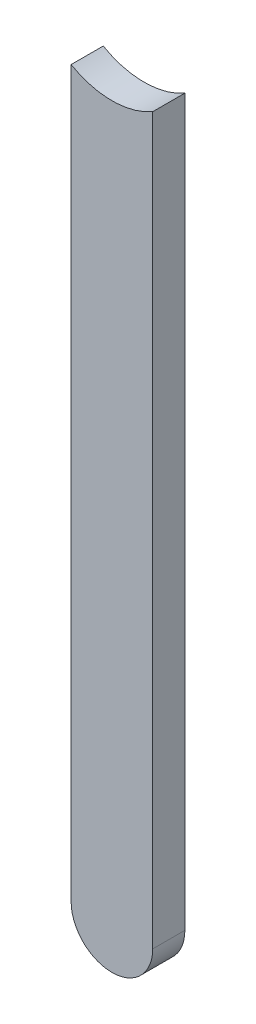
ISO-10303-21;
HEADER;
FILE_DESCRIPTION(('STEP AP214'),'2;1');
FILE_NAME('part.step','',(''),(''),'','','');
FILE_SCHEMA(('AUTOMOTIVE_DESIGN { 1 0 10303 214 1 1 1 1 }'));
ENDSEC;
DATA;
#1=APPLICATION_CONTEXT('core data for automotive mechanical design processes');
#2=APPLICATION_PROTOCOL_DEFINITION('international standard','automotive_design',2000,#1);
#3=PRODUCT_CONTEXT('',#1,'mechanical');
#4=PRODUCT('Part','Part','',(#3));
#5=PRODUCT_RELATED_PRODUCT_CATEGORY('part','',(#4));
#6=PRODUCT_DEFINITION_FORMATION('','',#4);
#7=PRODUCT_DEFINITION_CONTEXT('part definition',#1,'design');
#8=PRODUCT_DEFINITION('design','',#6,#7);
#9=PRODUCT_DEFINITION_SHAPE('','',#8);
#10=(LENGTH_UNIT() NAMED_UNIT(*) SI_UNIT(.MILLI.,.METRE.));
#11=(NAMED_UNIT(*) PLANE_ANGLE_UNIT() SI_UNIT($,.RADIAN.));
#12=(NAMED_UNIT(*) SI_UNIT($,.STERADIAN.) SOLID_ANGLE_UNIT());
#13=UNCERTAINTY_MEASURE_WITH_UNIT(LENGTH_MEASURE(1.E-05),#10,'distance_accuracy_value','');
#14=(GEOMETRIC_REPRESENTATION_CONTEXT(3) GLOBAL_UNCERTAINTY_ASSIGNED_CONTEXT((#13)) GLOBAL_UNIT_ASSIGNED_CONTEXT((#10,
#11,#12)) REPRESENTATION_CONTEXT('',''));
#15=CARTESIAN_POINT('',(0.,0.,0.));
#16=DIRECTION('',(0.,0.,1.));
#17=DIRECTION('',(1.,0.,0.));
#18=AXIS2_PLACEMENT_3D('',#15,#16,#17);
#19=CARTESIAN_POINT('',(144.272,113.03,0.));
#20=DIRECTION('',(-1.,0.,0.));
#21=DIRECTION('',(0.,1.,0.));
#22=AXIS2_PLACEMENT_3D('',#19,#20,#21);
#23=PLANE('',#22);
#24=DIRECTION('',(0.,1.,0.));
#25=VECTOR('',#24,1.);
#26=CARTESIAN_POINT('',(144.272,113.03,0.1999996));
#27=LINE('',#26,#25);
#28=CARTESIAN_POINT('',(144.272,113.03,0.1999996));
#29=VERTEX_POINT('',#28);
#30=CARTESIAN_POINT('',(144.272,117.543059094878,0.1999996));
#31=VERTEX_POINT('',#30);
#32=EDGE_CURVE('E11',#29,#31,#27,.T.);
#33=ORIENTED_EDGE('',*,*,#32,.F.);
#34=DIRECTION('',(0.,0.,1.));
#35=VECTOR('',#34,1.);
#36=CARTESIAN_POINT('',(144.272,113.03,0.));
#37=LINE('',#36,#35);
#38=CARTESIAN_POINT('',(144.272,113.03,0.));
#39=VERTEX_POINT('',#38);
#40=EDGE_CURVE('E24',#39,#29,#37,.T.);
#41=ORIENTED_EDGE('',*,*,#40,.F.);
#42=DIRECTION('',(0.,1.,0.));
#43=VECTOR('',#42,1.);
#44=CARTESIAN_POINT('',(144.272,113.03,0.));
#45=LINE('',#44,#43);
#46=CARTESIAN_POINT('',(144.272,117.543059094878,0.));
#47=VERTEX_POINT('',#46);
#48=EDGE_CURVE('E75',#39,#47,#45,.T.);
#49=ORIENTED_EDGE('',*,*,#48,.T.);
#50=DIRECTION('',(0.,0.,1.));
#51=VECTOR('',#50,1.);
#52=CARTESIAN_POINT('',(144.272,117.543059094878,0.));
#53=LINE('',#52,#51);
#54=EDGE_CURVE('E37',#47,#31,#53,.T.);
#55=ORIENTED_EDGE('',*,*,#54,.T.);
#56=EDGE_LOOP('',(#33,#41,#49,#55));
#57=FACE_BOUND('',#56,.T.);
#58=ADVANCED_FACE('F17',(#57),#23,.F.);
#59=CARTESIAN_POINT('',(144.018,117.983,0.));
#60=DIRECTION('',(0.,0.,-1.));
#61=DIRECTION('',(1.,0.,0.));
#62=AXIS2_PLACEMENT_3D('',#59,#60,#61);
#63=CYLINDRICAL_SURFACE('',#62,0.508);
#64=DIRECTION('',(0.,0.,1.));
#65=VECTOR('',#64,1.);
#66=CARTESIAN_POINT('',(143.764,117.543059094878,0.));
#67=LINE('',#66,#65);
#68=CARTESIAN_POINT('',(143.764,117.543059094878,0.));
#69=VERTEX_POINT('',#68);
#70=CARTESIAN_POINT('',(143.764,117.543059094878,0.1999996));
#71=VERTEX_POINT('',#70);
#72=EDGE_CURVE('E67',#69,#71,#67,.T.);
#73=ORIENTED_EDGE('',*,*,#72,.T.);
#74=CARTESIAN_POINT('',(144.018,117.983,0.1999996));
#75=DIRECTION('',(0.,0.,1.));
#76=DIRECTION('',(1.,0.,0.));
#77=AXIS2_PLACEMENT_3D('',#74,#75,#76);
#78=CIRCLE('',#77,0.508);
#79=EDGE_CURVE('E82',#71,#31,#78,.T.);
#80=ORIENTED_EDGE('',*,*,#79,.T.);
#81=ORIENTED_EDGE('',*,*,#54,.F.);
#82=CARTESIAN_POINT('',(144.018,117.983,0.));
#83=DIRECTION('',(0.,0.,1.));
#84=DIRECTION('',(1.,0.,0.));
#85=AXIS2_PLACEMENT_3D('',#82,#83,#84);
#86=CIRCLE('',#85,0.508);
#87=EDGE_CURVE('E80',#69,#47,#86,.T.);
#88=ORIENTED_EDGE('',*,*,#87,.F.);
#89=EDGE_LOOP('',(#73,#80,#81,#88));
#90=FACE_BOUND('',#89,.T.);
#91=ADVANCED_FACE('F88',(#90),#63,.F.);
#92=CARTESIAN_POINT('',(143.764,117.543059094878,0.));
#93=DIRECTION('',(1.,0.,0.));
#94=DIRECTION('',(0.,-1.,0.));
#95=AXIS2_PLACEMENT_3D('',#92,#93,#94);
#96=PLANE('',#95);
#97=DIRECTION('',(0.,-1.,0.));
#98=VECTOR('',#97,1.);
#99=CARTESIAN_POINT('',(143.764,117.983,0.1999996));
#100=LINE('',#99,#98);
#101=CARTESIAN_POINT('',(143.764,113.03,0.1999996));
#102=VERTEX_POINT('',#101);
#103=EDGE_CURVE('E71',#71,#102,#100,.T.);
#104=ORIENTED_EDGE('',*,*,#103,.F.);
#105=ORIENTED_EDGE('',*,*,#72,.F.);
#106=DIRECTION('',(0.,-1.,0.));
#107=VECTOR('',#106,1.);
#108=CARTESIAN_POINT('',(143.764,117.983,0.));
#109=LINE('',#108,#107);
#110=CARTESIAN_POINT('',(143.764,113.03,0.));
#111=VERTEX_POINT('',#110);
#112=EDGE_CURVE('E63',#69,#111,#109,.T.);
#113=ORIENTED_EDGE('',*,*,#112,.T.);
#114=DIRECTION('',(0.,0.,1.));
#115=VECTOR('',#114,1.);
#116=CARTESIAN_POINT('',(143.764,113.03,0.));
#117=LINE('',#116,#115);
#118=EDGE_CURVE('E53',#111,#102,#117,.T.);
#119=ORIENTED_EDGE('',*,*,#118,.T.);
#120=EDGE_LOOP('',(#104,#105,#113,#119));
#121=FACE_BOUND('',#120,.T.);
#122=ADVANCED_FACE('F66',(#121),#96,.F.);
#123=CARTESIAN_POINT('',(144.018,113.03,0.));
#124=DIRECTION('',(0.,0.,-1.));
#125=DIRECTION('',(-1.,1.11896493820492E-13,0.));
#126=AXIS2_PLACEMENT_3D('',#123,#124,#125);
#127=CYLINDRICAL_SURFACE('',#126,0.253999999999986);
#128=CARTESIAN_POINT('',(144.018,113.03,0.1999996));
#129=DIRECTION('',(0.,0.,1.));
#130=DIRECTION('',(-1.,1.11896493820492E-13,0.));
#131=AXIS2_PLACEMENT_3D('',#128,#129,#130);
#132=CIRCLE('',#131,0.253999999999986);
#133=EDGE_CURVE('E59',#102,#29,#132,.T.);
#134=ORIENTED_EDGE('',*,*,#133,.F.);
#135=ORIENTED_EDGE('',*,*,#118,.F.);
#136=CARTESIAN_POINT('',(144.018,113.03,0.));
#137=DIRECTION('',(0.,0.,1.));
#138=DIRECTION('',(-1.,1.11896493820492E-13,0.));
#139=AXIS2_PLACEMENT_3D('',#136,#137,#138);
#140=CIRCLE('',#139,0.253999999999986);
#141=EDGE_CURVE('E57',#111,#39,#140,.T.);
#142=ORIENTED_EDGE('',*,*,#141,.T.);
#143=ORIENTED_EDGE('',*,*,#40,.T.);
#144=EDGE_LOOP('',(#134,#135,#142,#143));
#145=FACE_BOUND('',#144,.T.);
#146=ADVANCED_FACE('F55',(#145),#127,.T.);
#147=CARTESIAN_POINT('',(144.272,113.03,0.));
#148=DIRECTION('',(0.,0.,-1.));
#149=DIRECTION('',(-1.,0.,0.));
#150=AXIS2_PLACEMENT_3D('',#147,#148,#149);
#151=PLANE('',#150);
#152=ORIENTED_EDGE('',*,*,#48,.F.);
#153=ORIENTED_EDGE('',*,*,#141,.F.);
#154=ORIENTED_EDGE('',*,*,#112,.F.);
#155=ORIENTED_EDGE('',*,*,#87,.T.);
#156=EDGE_LOOP('',(#152,#153,#154,#155));
#157=FACE_BOUND('',#156,.T.);
#158=ADVANCED_FACE('F74',(#157),#151,.T.);
#159=CARTESIAN_POINT('',(144.272,113.03,0.1999996));
#160=DIRECTION('',(0.,0.,-1.));
#161=DIRECTION('',(-1.,0.,0.));
#162=AXIS2_PLACEMENT_3D('',#159,#160,#161);
#163=PLANE('',#162);
#164=ORIENTED_EDGE('',*,*,#133,.T.);
#165=ORIENTED_EDGE('',*,*,#32,.T.);
#166=ORIENTED_EDGE('',*,*,#79,.F.);
#167=ORIENTED_EDGE('',*,*,#103,.T.);
#168=EDGE_LOOP('',(#164,#165,#166,#167));
#169=FACE_BOUND('',#168,.T.);
#170=ADVANCED_FACE('F91',(#169),#163,.F.);
#171=CLOSED_SHELL('',(#58,#91,#122,#146,#158,#170));
#172=MANIFOLD_SOLID_BREP('B1',#171);
#173=ADVANCED_BREP_SHAPE_REPRESENTATION('',(#18,#172),#14);
#174=SHAPE_DEFINITION_REPRESENTATION(#9,#173);
ENDSEC;
END-ISO-10303-21;
